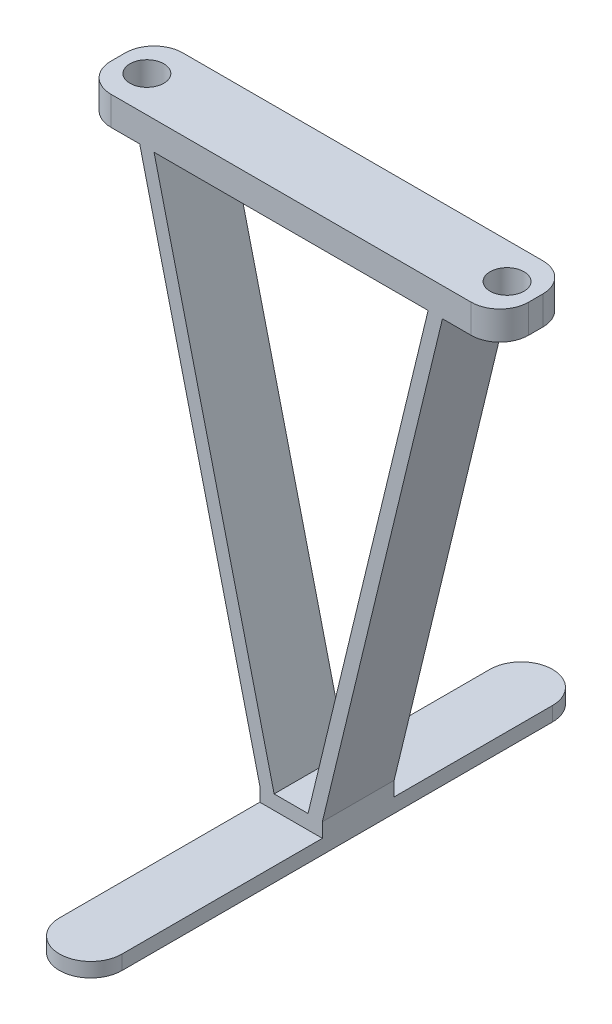
ISO-10303-21;
HEADER;
FILE_DESCRIPTION(('STEP AP214'),'2;1');
FILE_NAME('part.step','',(''),(''),'','','');
FILE_SCHEMA(('AUTOMOTIVE_DESIGN { 1 0 10303 214 1 1 1 1 }'));
ENDSEC;
DATA;
#1=APPLICATION_CONTEXT('core data for automotive mechanical design processes');
#2=APPLICATION_PROTOCOL_DEFINITION('international standard','automotive_design',2000,#1);
#3=PRODUCT_CONTEXT('',#1,'mechanical');
#4=PRODUCT('Part','Part','',(#3));
#5=PRODUCT_RELATED_PRODUCT_CATEGORY('part','',(#4));
#6=PRODUCT_DEFINITION_FORMATION('','',#4);
#7=PRODUCT_DEFINITION_CONTEXT('part definition',#1,'design');
#8=PRODUCT_DEFINITION('design','',#6,#7);
#9=PRODUCT_DEFINITION_SHAPE('','',#8);
#10=(LENGTH_UNIT() NAMED_UNIT(*) SI_UNIT(.MILLI.,.METRE.));
#11=(NAMED_UNIT(*) PLANE_ANGLE_UNIT() SI_UNIT($,.RADIAN.));
#12=(NAMED_UNIT(*) SI_UNIT($,.STERADIAN.) SOLID_ANGLE_UNIT());
#13=UNCERTAINTY_MEASURE_WITH_UNIT(LENGTH_MEASURE(1.E-05),#10,'distance_accuracy_value','');
#14=(GEOMETRIC_REPRESENTATION_CONTEXT(3) GLOBAL_UNCERTAINTY_ASSIGNED_CONTEXT((#13)) GLOBAL_UNIT_ASSIGNED_CONTEXT((#10,
#11,#12)) REPRESENTATION_CONTEXT('',''));
#15=CARTESIAN_POINT('',(0.,0.,0.));
#16=DIRECTION('',(0.,0.,1.));
#17=DIRECTION('',(1.,0.,0.));
#18=AXIS2_PLACEMENT_3D('',#15,#16,#17);
#19=CARTESIAN_POINT('',(33.3542059614696,0.,-1.27));
#20=DIRECTION('',(0.,-1.,0.));
#21=DIRECTION('',(0.,0.,-1.));
#22=AXIS2_PLACEMENT_3D('',#19,#20,#21);
#23=PLANE('',#22);
#24=DIRECTION('',(0.,0.,1.));
#25=VECTOR('',#24,1.);
#26=CARTESIAN_POINT('',(-22.7797940385304,0.,-6.35));
#27=LINE('',#26,#25);
#28=CARTESIAN_POINT('',(-22.7797940385304,0.,-6.35));
#29=VERTEX_POINT('',#28);
#30=CARTESIAN_POINT('',(-22.7797940385304,0.,6.34999999999999));
#31=VERTEX_POINT('',#30);
#32=EDGE_CURVE('E298',#29,#31,#27,.T.);
#33=ORIENTED_EDGE('',*,*,#32,.F.);
#34=DIRECTION('',(-1.,0.,0.));
#35=VECTOR('',#34,1.);
#36=CARTESIAN_POINT('',(27.702035124836,0.,-6.35));
#37=LINE('',#36,#35);
#38=CARTESIAN_POINT('',(25.7342059614696,0.,-6.35));
#39=VERTEX_POINT('',#38);
#40=EDGE_CURVE('E395',#39,#29,#37,.T.);
#41=ORIENTED_EDGE('',*,*,#40,.F.);
#42=DIRECTION('',(0.,0.,1.));
#43=VECTOR('',#42,1.);
#44=CARTESIAN_POINT('',(25.7342059614696,0.,-6.35));
#45=LINE('',#44,#43);
#46=CARTESIAN_POINT('',(25.7342059614696,0.,6.34999999999999));
#47=VERTEX_POINT('',#46);
#48=EDGE_CURVE('E308',#39,#47,#45,.T.);
#49=ORIENTED_EDGE('',*,*,#48,.T.);
#50=DIRECTION('',(1.,0.,0.));
#51=VECTOR('',#50,1.);
#52=CARTESIAN_POINT('',(27.702035124836,0.,6.35));
#53=LINE('',#52,#51);
#54=EDGE_CURVE('E382',#31,#47,#53,.T.);
#55=ORIENTED_EDGE('',*,*,#54,.F.);
#56=EDGE_LOOP('',(#33,#41,#49,#55));
#57=FACE_BOUND('',#56,.T.);
#58=ADVANCED_FACE('F49',(#57),#23,.T.);
#59=DIRECTION('',(0.,0.,1.));
#60=VECTOR('',#59,1.);
#61=CARTESIAN_POINT('',(28.2742059614696,0.,-6.35));
#62=LINE('',#61,#60);
#63=CARTESIAN_POINT('',(28.2742059614696,0.,-6.35));
#64=VERTEX_POINT('',#63);
#65=CARTESIAN_POINT('',(28.2742059614696,0.,6.34999999999999));
#66=VERTEX_POINT('',#65);
#67=EDGE_CURVE('E312',#64,#66,#62,.T.);
#68=ORIENTED_EDGE('',*,*,#67,.F.);
#69=CARTESIAN_POINT('',(33.3542059614696,0.,-6.35));
#70=VERTEX_POINT('',#69);
#71=EDGE_CURVE('E344',#70,#64,#37,.T.);
#72=ORIENTED_EDGE('',*,*,#71,.F.);
#73=CARTESIAN_POINT('',(33.3542059614696,0.,-1.27));
#74=DIRECTION('',(0.,1.,0.));
#75=DIRECTION('',(0.,0.,-1.));
#76=AXIS2_PLACEMENT_3D('',#73,#74,#75);
#77=CIRCLE('',#76,5.08);
#78=CARTESIAN_POINT('',(38.4342059614696,0.,-1.26999999999996));
#79=VERTEX_POINT('',#78);
#80=EDGE_CURVE('E388',#79,#70,#77,.T.);
#81=ORIENTED_EDGE('',*,*,#80,.F.);
#82=DIRECTION('',(0.,0.,-1.));
#83=VECTOR('',#82,1.);
#84=CARTESIAN_POINT('',(38.4342059614696,0.,-1.26999999999996));
#85=LINE('',#84,#83);
#86=CARTESIAN_POINT('',(38.4342059614696,0.,1.26999999999996));
#87=VERTEX_POINT('',#86);
#88=EDGE_CURVE('E385',#87,#79,#85,.T.);
#89=ORIENTED_EDGE('',*,*,#88,.F.);
#90=CARTESIAN_POINT('',(33.3542059614696,0.,1.27));
#91=DIRECTION('',(0.,1.,0.));
#92=DIRECTION('',(0.,0.,-1.));
#93=AXIS2_PLACEMENT_3D('',#90,#91,#92);
#94=CIRCLE('',#93,5.08);
#95=CARTESIAN_POINT('',(33.3542059614696,0.,6.35));
#96=VERTEX_POINT('',#95);
#97=EDGE_CURVE('E381',#96,#87,#94,.T.);
#98=ORIENTED_EDGE('',*,*,#97,.F.);
#99=EDGE_CURVE('E376',#66,#96,#53,.T.);
#100=ORIENTED_EDGE('',*,*,#99,.F.);
#101=EDGE_LOOP('',(#68,#72,#81,#89,#98,#100));
#102=FACE_BOUND('',#101,.T.);
#103=CARTESIAN_POINT('',(33.3542059614696,0.,0.));
#104=DIRECTION('',(0.,1.,0.));
#105=DIRECTION('',(0.,0.,1.));
#106=AXIS2_PLACEMENT_3D('',#103,#104,#105);
#107=CIRCLE('',#106,3.);
#108=CARTESIAN_POINT('',(33.3542059614696,0.,3.));
#109=VERTEX_POINT('',#108);
#110=EDGE_CURVE('E301',#109,#109,#107,.T.);
#111=ORIENTED_EDGE('',*,*,#110,.T.);
#112=EDGE_LOOP('',(#111));
#113=FACE_BOUND('',#112,.T.);
#114=ADVANCED_FACE('F480',(#102,#113),#23,.T.);
#115=CARTESIAN_POINT('',(33.3542059614696,5.08,-1.27));
#116=DIRECTION('',(0.,-1.,0.));
#117=DIRECTION('',(0.,0.,-1.));
#118=AXIS2_PLACEMENT_3D('',#115,#116,#117);
#119=PLANE('',#118);
#120=DIRECTION('',(-1.,0.,0.));
#121=VECTOR('',#120,1.);
#122=CARTESIAN_POINT('',(-24.7476232018967,5.08,-6.35));
#123=LINE('',#122,#121);
#124=CARTESIAN_POINT('',(33.3542059614696,5.08,-6.35));
#125=VERTEX_POINT('',#124);
#126=CARTESIAN_POINT('',(-30.3997940385303,5.08,-6.35));
#127=VERTEX_POINT('',#126);
#128=EDGE_CURVE('E340',#125,#127,#123,.T.);
#129=ORIENTED_EDGE('',*,*,#128,.T.);
#130=CARTESIAN_POINT('',(-30.3997940385304,5.08,-1.27));
#131=DIRECTION('',(0.,1.,0.));
#132=DIRECTION('',(0.,0.,-1.));
#133=AXIS2_PLACEMENT_3D('',#130,#131,#132);
#134=CIRCLE('',#133,5.08);
#135=CARTESIAN_POINT('',(-35.4797940385304,5.08,-1.26999999999996));
#136=VERTEX_POINT('',#135);
#137=EDGE_CURVE('E343',#127,#136,#134,.T.);
#138=ORIENTED_EDGE('',*,*,#137,.T.);
#139=DIRECTION('',(0.,0.,1.));
#140=VECTOR('',#139,1.);
#141=CARTESIAN_POINT('',(-35.4797940385304,5.08,-1.26999999999996));
#142=LINE('',#141,#140);
#143=CARTESIAN_POINT('',(-35.4797940385304,5.08,1.26999999999996));
#144=VERTEX_POINT('',#143);
#145=EDGE_CURVE('E347',#136,#144,#142,.T.);
#146=ORIENTED_EDGE('',*,*,#145,.T.);
#147=CARTESIAN_POINT('',(-30.3997940385304,5.08,1.27));
#148=DIRECTION('',(0.,1.,0.));
#149=DIRECTION('',(0.,0.,1.));
#150=AXIS2_PLACEMENT_3D('',#147,#148,#149);
#151=CIRCLE('',#150,5.08);
#152=CARTESIAN_POINT('',(-30.3997940385304,5.08,6.35));
#153=VERTEX_POINT('',#152);
#154=EDGE_CURVE('E350',#144,#153,#151,.T.);
#155=ORIENTED_EDGE('',*,*,#154,.T.);
#156=DIRECTION('',(1.,0.,0.));
#157=VECTOR('',#156,1.);
#158=CARTESIAN_POINT('',(-24.7476232018967,5.08,6.35));
#159=LINE('',#158,#157);
#160=CARTESIAN_POINT('',(33.3542059614696,5.08,6.35));
#161=VERTEX_POINT('',#160);
#162=EDGE_CURVE('E353',#153,#161,#159,.T.);
#163=ORIENTED_EDGE('',*,*,#162,.T.);
#164=CARTESIAN_POINT('',(33.3542059614696,5.08,1.27));
#165=DIRECTION('',(0.,1.,0.));
#166=DIRECTION('',(0.,0.,-1.));
#167=AXIS2_PLACEMENT_3D('',#164,#165,#166);
#168=CIRCLE('',#167,5.08);
#169=CARTESIAN_POINT('',(38.4342059614696,5.08,1.26999999999996));
#170=VERTEX_POINT('',#169);
#171=EDGE_CURVE('E356',#161,#170,#168,.T.);
#172=ORIENTED_EDGE('',*,*,#171,.T.);
#173=DIRECTION('',(0.,0.,-1.));
#174=VECTOR('',#173,1.);
#175=CARTESIAN_POINT('',(38.4342059614696,5.08,-1.26999999999996));
#176=LINE('',#175,#174);
#177=CARTESIAN_POINT('',(38.4342059614696,5.08,-1.26999999999996));
#178=VERTEX_POINT('',#177);
#179=EDGE_CURVE('E359',#170,#178,#176,.T.);
#180=ORIENTED_EDGE('',*,*,#179,.T.);
#181=CARTESIAN_POINT('',(33.3542059614696,5.08,-1.27));
#182=DIRECTION('',(0.,1.,0.));
#183=DIRECTION('',(0.,0.,-1.));
#184=AXIS2_PLACEMENT_3D('',#181,#182,#183);
#185=CIRCLE('',#184,5.08);
#186=EDGE_CURVE('E362',#178,#125,#185,.T.);
#187=ORIENTED_EDGE('',*,*,#186,.T.);
#188=EDGE_LOOP('',(#129,#138,#146,#155,#163,#172,#180,#187));
#189=FACE_BOUND('',#188,.T.);
#190=CARTESIAN_POINT('',(-30.3997940385304,5.08,0.));
#191=DIRECTION('',(0.,1.,0.));
#192=DIRECTION('',(0.,0.,1.));
#193=AXIS2_PLACEMENT_3D('',#190,#191,#192);
#194=CIRCLE('',#193,3.);
#195=CARTESIAN_POINT('',(-30.3997940385304,5.08,3.));
#196=VERTEX_POINT('',#195);
#197=EDGE_CURVE('E332',#196,#196,#194,.T.);
#198=ORIENTED_EDGE('',*,*,#197,.F.);
#199=EDGE_LOOP('',(#198));
#200=FACE_BOUND('',#199,.T.);
#201=CARTESIAN_POINT('',(33.3542059614696,5.08,0.));
#202=DIRECTION('',(0.,1.,0.));
#203=DIRECTION('',(0.,0.,1.));
#204=AXIS2_PLACEMENT_3D('',#201,#202,#203);
#205=CIRCLE('',#204,3.);
#206=CARTESIAN_POINT('',(33.3542059614696,5.08,3.));
#207=VERTEX_POINT('',#206);
#208=EDGE_CURVE('E324',#207,#207,#205,.T.);
#209=ORIENTED_EDGE('',*,*,#208,.F.);
#210=EDGE_LOOP('',(#209));
#211=FACE_BOUND('',#210,.T.);
#212=ADVANCED_FACE('F445',(#189,#200,#211),#119,.F.);
#213=DIRECTION('',(0.,0.,1.));
#214=VECTOR('',#213,1.);
#215=CARTESIAN_POINT('',(-25.3197940385304,0.,-6.35));
#216=LINE('',#215,#214);
#217=CARTESIAN_POINT('',(-25.3197940385304,0.,-6.35000000000001));
#218=VERTEX_POINT('',#217);
#219=CARTESIAN_POINT('',(-25.3197940385304,0.,6.34999999999999));
#220=VERTEX_POINT('',#219);
#221=EDGE_CURVE('E271',#218,#220,#216,.T.);
#222=ORIENTED_EDGE('',*,*,#221,.T.);
#223=CARTESIAN_POINT('',(-30.3997940385304,0.,6.35));
#224=VERTEX_POINT('',#223);
#225=EDGE_CURVE('E377',#224,#220,#53,.T.);
#226=ORIENTED_EDGE('',*,*,#225,.F.);
#227=CARTESIAN_POINT('',(-30.3997940385304,0.,1.27));
#228=DIRECTION('',(0.,1.,0.));
#229=DIRECTION('',(0.,0.,1.));
#230=AXIS2_PLACEMENT_3D('',#227,#228,#229);
#231=CIRCLE('',#230,5.08);
#232=CARTESIAN_POINT('',(-35.4797940385304,0.,1.26999999999996));
#233=VERTEX_POINT('',#232);
#234=EDGE_CURVE('E372',#233,#224,#231,.T.);
#235=ORIENTED_EDGE('',*,*,#234,.F.);
#236=DIRECTION('',(0.,0.,1.));
#237=VECTOR('',#236,1.);
#238=CARTESIAN_POINT('',(-35.4797940385304,0.,-1.26999999999996));
#239=LINE('',#238,#237);
#240=CARTESIAN_POINT('',(-35.4797940385304,0.,-1.26999999999996));
#241=VERTEX_POINT('',#240);
#242=EDGE_CURVE('E369',#241,#233,#239,.T.);
#243=ORIENTED_EDGE('',*,*,#242,.F.);
#244=CARTESIAN_POINT('',(-30.3997940385304,0.,-1.27));
#245=DIRECTION('',(0.,1.,0.));
#246=DIRECTION('',(0.,0.,-1.));
#247=AXIS2_PLACEMENT_3D('',#244,#245,#246);
#248=CIRCLE('',#247,5.08);
#249=CARTESIAN_POINT('',(-30.3997940385303,0.,-6.35));
#250=VERTEX_POINT('',#249);
#251=EDGE_CURVE('E336',#250,#241,#248,.T.);
#252=ORIENTED_EDGE('',*,*,#251,.F.);
#253=EDGE_CURVE('E391',#218,#250,#37,.T.);
#254=ORIENTED_EDGE('',*,*,#253,.F.);
#255=EDGE_LOOP('',(#222,#226,#235,#243,#252,#254));
#256=FACE_BOUND('',#255,.T.);
#257=CARTESIAN_POINT('',(-30.3997940385304,0.,0.));
#258=DIRECTION('',(0.,1.,0.));
#259=DIRECTION('',(0.,0.,1.));
#260=AXIS2_PLACEMENT_3D('',#257,#258,#259);
#261=CIRCLE('',#260,3.);
#262=CARTESIAN_POINT('',(-30.3997940385304,0.,3.));
#263=VERTEX_POINT('',#262);
#264=EDGE_CURVE('E328',#263,#263,#261,.T.);
#265=ORIENTED_EDGE('',*,*,#264,.T.);
#266=EDGE_LOOP('',(#265));
#267=FACE_BOUND('',#266,.T.);
#268=ADVANCED_FACE('F431',(#256,#267),#23,.T.);
#269=CARTESIAN_POINT('',(-30.3997940385304,5.08,-1.27));
#270=DIRECTION('',(0.,-1.,0.));
#271=DIRECTION('',(0.,0.,-1.));
#272=AXIS2_PLACEMENT_3D('',#269,#270,#271);
#273=CYLINDRICAL_SURFACE('',#272,5.08);
#274=ORIENTED_EDGE('',*,*,#251,.T.);
#275=DIRECTION('',(0.,-1.,0.));
#276=VECTOR('',#275,1.);
#277=CARTESIAN_POINT('',(-35.4797940385304,5.08,-1.26999999999996));
#278=LINE('',#277,#276);
#279=EDGE_CURVE('E58',#136,#241,#278,.T.);
#280=ORIENTED_EDGE('',*,*,#279,.F.);
#281=ORIENTED_EDGE('',*,*,#137,.F.);
#282=DIRECTION('',(0.,-1.,0.));
#283=VECTOR('',#282,1.);
#284=CARTESIAN_POINT('',(-30.3997940385303,5.08,-6.35));
#285=LINE('',#284,#283);
#286=EDGE_CURVE('E11',#127,#250,#285,.T.);
#287=ORIENTED_EDGE('',*,*,#286,.T.);
#288=EDGE_LOOP('',(#274,#280,#281,#287));
#289=FACE_BOUND('',#288,.T.);
#290=ADVANCED_FACE('F51',(#289),#273,.T.);
#291=CARTESIAN_POINT('',(-35.4797940385304,5.08,-1.26999999999996));
#292=DIRECTION('',(1.,0.,0.));
#293=DIRECTION('',(0.,0.,-1.));
#294=AXIS2_PLACEMENT_3D('',#291,#292,#293);
#295=PLANE('',#294);
#296=ORIENTED_EDGE('',*,*,#242,.T.);
#297=DIRECTION('',(0.,-1.,0.));
#298=VECTOR('',#297,1.);
#299=CARTESIAN_POINT('',(-35.4797940385304,5.08,1.26999999999996));
#300=LINE('',#299,#298);
#301=EDGE_CURVE('E414',#144,#233,#300,.T.);
#302=ORIENTED_EDGE('',*,*,#301,.F.);
#303=ORIENTED_EDGE('',*,*,#145,.F.);
#304=ORIENTED_EDGE('',*,*,#279,.T.);
#305=EDGE_LOOP('',(#296,#302,#303,#304));
#306=FACE_BOUND('',#305,.T.);
#307=ADVANCED_FACE('F424',(#306),#295,.F.);
#308=CARTESIAN_POINT('',(-30.3997940385304,5.08,1.27));
#309=DIRECTION('',(0.,-1.,0.));
#310=DIRECTION('',(0.,0.,-1.));
#311=AXIS2_PLACEMENT_3D('',#308,#309,#310);
#312=CYLINDRICAL_SURFACE('',#311,5.08);
#313=ORIENTED_EDGE('',*,*,#234,.T.);
#314=DIRECTION('',(0.,-1.,0.));
#315=VECTOR('',#314,1.);
#316=CARTESIAN_POINT('',(-30.3997940385304,5.08,6.35));
#317=LINE('',#316,#315);
#318=EDGE_CURVE('E410',#153,#224,#317,.T.);
#319=ORIENTED_EDGE('',*,*,#318,.F.);
#320=ORIENTED_EDGE('',*,*,#154,.F.);
#321=ORIENTED_EDGE('',*,*,#301,.T.);
#322=EDGE_LOOP('',(#313,#319,#320,#321));
#323=FACE_BOUND('',#322,.T.);
#324=ADVANCED_FACE('F436',(#323),#312,.T.);
#325=CARTESIAN_POINT('',(27.702035124836,5.08,6.35));
#326=DIRECTION('',(0.,0.,-1.));
#327=DIRECTION('',(-1.,0.,0.));
#328=AXIS2_PLACEMENT_3D('',#325,#326,#327);
#329=PLANE('',#328);
#330=ORIENTED_EDGE('',*,*,#225,.T.);
#331=DIRECTION('',(0.23545280333934,-0.971885784132912,0.));
#332=VECTOR('',#331,1.);
#333=CARTESIAN_POINT('',(-25.3197940385304,0.,6.34999999999999));
#334=LINE('',#333,#332);
#335=CARTESIAN_POINT('',(-4.06279403853036,-87.7431732402802,6.34999999999999));
#336=VERTEX_POINT('',#335);
#337=EDGE_CURVE('E232',#220,#336,#334,.T.);
#338=ORIENTED_EDGE('',*,*,#337,.T.);
#339=DIRECTION('',(0.,-1.,0.));
#340=VECTOR('',#339,1.);
#341=CARTESIAN_POINT('',(-4.06279403853036,-87.7431732402802,6.34999999999999));
#342=LINE('',#341,#340);
#343=CARTESIAN_POINT('',(-4.06279403853036,-90.2831732402802,6.34999999999999));
#344=VERTEX_POINT('',#343);
#345=EDGE_CURVE('E238',#336,#344,#342,.T.);
#346=ORIENTED_EDGE('',*,*,#345,.T.);
#347=DIRECTION('',(1.,0.,0.));
#348=VECTOR('',#347,1.);
#349=CARTESIAN_POINT('',(7.01720596146964,-90.2831732402802,6.34999999999999));
#350=LINE('',#349,#348);
#351=CARTESIAN_POINT('',(7.01720596146964,-90.2831732402802,6.34999999999999));
#352=VERTEX_POINT('',#351);
#353=EDGE_CURVE('E275',#344,#352,#350,.T.);
#354=ORIENTED_EDGE('',*,*,#353,.T.);
#355=DIRECTION('',(0.,1.,0.));
#356=VECTOR('',#355,1.);
#357=CARTESIAN_POINT('',(7.01720596146964,-87.7431732402802,6.34999999999999));
#358=LINE('',#357,#356);
#359=CARTESIAN_POINT('',(7.01720596146964,-87.7431732402802,6.34999999999999));
#360=VERTEX_POINT('',#359);
#361=EDGE_CURVE('E279',#352,#360,#358,.T.);
#362=ORIENTED_EDGE('',*,*,#361,.T.);
#363=DIRECTION('',(0.235452803339339,0.971885784132912,0.));
#364=VECTOR('',#363,1.);
#365=CARTESIAN_POINT('',(28.2742059614696,0.,6.34999999999999));
#366=LINE('',#365,#364);
#367=EDGE_CURVE('E283',#360,#66,#366,.T.);
#368=ORIENTED_EDGE('',*,*,#367,.T.);
#369=ORIENTED_EDGE('',*,*,#99,.T.);
#370=DIRECTION('',(0.,-1.,0.));
#371=VECTOR('',#370,1.);
#372=CARTESIAN_POINT('',(33.3542059614696,5.08,6.35));
#373=LINE('',#372,#371);
#374=EDGE_CURVE('E406',#161,#96,#373,.T.);
#375=ORIENTED_EDGE('',*,*,#374,.F.);
#376=ORIENTED_EDGE('',*,*,#162,.F.);
#377=ORIENTED_EDGE('',*,*,#318,.T.);
#378=EDGE_LOOP('',(#330,#338,#346,#354,#362,#368,#369,#375,#376,#377));
#379=FACE_BOUND('',#378,.T.);
#380=DIRECTION('',(-0.23545280333934,0.971885784132912,0.));
#381=VECTOR('',#380,1.);
#382=CARTESIAN_POINT('',(-22.7797940385304,0.,6.34999999999999));
#383=LINE('',#382,#381);
#384=CARTESIAN_POINT('',(-1.52279403853036,-87.7431732402802,6.34999999999999));
#385=VERTEX_POINT('',#384);
#386=EDGE_CURVE('E248',#385,#31,#383,.T.);
#387=ORIENTED_EDGE('',*,*,#386,.T.);
#388=ORIENTED_EDGE('',*,*,#54,.T.);
#389=DIRECTION('',(-0.23545280333934,-0.971885784132912,0.));
#390=VECTOR('',#389,1.);
#391=CARTESIAN_POINT('',(25.7342059614696,0.,6.34999999999999));
#392=LINE('',#391,#390);
#393=CARTESIAN_POINT('',(4.4772059614696,-87.7431732402802,6.34999999999999));
#394=VERTEX_POINT('',#393);
#395=EDGE_CURVE('E287',#47,#394,#392,.T.);
#396=ORIENTED_EDGE('',*,*,#395,.T.);
#397=DIRECTION('',(-1.,0.,0.));
#398=VECTOR('',#397,1.);
#399=CARTESIAN_POINT('',(4.4772059614696,-87.7431732402802,6.34999999999999));
#400=LINE('',#399,#398);
#401=EDGE_CURVE('E291',#394,#385,#400,.T.);
#402=ORIENTED_EDGE('',*,*,#401,.T.);
#403=EDGE_LOOP('',(#387,#388,#396,#402));
#404=FACE_BOUND('',#403,.T.);
#405=ADVANCED_FACE('F440',(#379,#404),#329,.F.);
#406=CARTESIAN_POINT('',(33.3542059614696,5.08,1.27));
#407=DIRECTION('',(0.,-1.,0.));
#408=DIRECTION('',(0.,0.,-1.));
#409=AXIS2_PLACEMENT_3D('',#406,#407,#408);
#410=CYLINDRICAL_SURFACE('',#409,5.08);
#411=ORIENTED_EDGE('',*,*,#97,.T.);
#412=DIRECTION('',(0.,-1.,0.));
#413=VECTOR('',#412,1.);
#414=CARTESIAN_POINT('',(38.4342059614696,5.08,1.26999999999996));
#415=LINE('',#414,#413);
#416=EDGE_CURVE('E402',#170,#87,#415,.T.);
#417=ORIENTED_EDGE('',*,*,#416,.F.);
#418=ORIENTED_EDGE('',*,*,#171,.F.);
#419=ORIENTED_EDGE('',*,*,#374,.T.);
#420=EDGE_LOOP('',(#411,#417,#418,#419));
#421=FACE_BOUND('',#420,.T.);
#422=ADVANCED_FACE('F598',(#421),#410,.T.);
#423=CARTESIAN_POINT('',(38.4342059614696,5.08,-1.26999999999996));
#424=DIRECTION('',(-1.,0.,0.));
#425=DIRECTION('',(0.,0.,1.));
#426=AXIS2_PLACEMENT_3D('',#423,#424,#425);
#427=PLANE('',#426);
#428=ORIENTED_EDGE('',*,*,#88,.T.);
#429=DIRECTION('',(0.,-1.,0.));
#430=VECTOR('',#429,1.);
#431=CARTESIAN_POINT('',(38.4342059614696,5.08,-1.26999999999996));
#432=LINE('',#431,#430);
#433=EDGE_CURVE('E399',#178,#79,#432,.T.);
#434=ORIENTED_EDGE('',*,*,#433,.F.);
#435=ORIENTED_EDGE('',*,*,#179,.F.);
#436=ORIENTED_EDGE('',*,*,#416,.T.);
#437=EDGE_LOOP('',(#428,#434,#435,#436));
#438=FACE_BOUND('',#437,.T.);
#439=ADVANCED_FACE('F705',(#438),#427,.F.);
#440=CARTESIAN_POINT('',(33.3542059614696,5.08,-1.27));
#441=DIRECTION('',(0.,-1.,0.));
#442=DIRECTION('',(0.,0.,-1.));
#443=AXIS2_PLACEMENT_3D('',#440,#441,#442);
#444=CYLINDRICAL_SURFACE('',#443,5.08);
#445=ORIENTED_EDGE('',*,*,#80,.T.);
#446=DIRECTION('',(0.,-1.,0.));
#447=VECTOR('',#446,1.);
#448=CARTESIAN_POINT('',(33.3542059614696,5.08,-6.35));
#449=LINE('',#448,#447);
#450=EDGE_CURVE('E366',#125,#70,#449,.T.);
#451=ORIENTED_EDGE('',*,*,#450,.F.);
#452=ORIENTED_EDGE('',*,*,#186,.F.);
#453=ORIENTED_EDGE('',*,*,#433,.T.);
#454=EDGE_LOOP('',(#445,#451,#452,#453));
#455=FACE_BOUND('',#454,.T.);
#456=ADVANCED_FACE('F609',(#455),#444,.T.);
#457=CARTESIAN_POINT('',(27.702035124836,5.08,-6.35));
#458=DIRECTION('',(0.,0.,1.));
#459=DIRECTION('',(1.,0.,0.));
#460=AXIS2_PLACEMENT_3D('',#457,#458,#459);
#461=PLANE('',#460);
#462=DIRECTION('',(0.23545280333934,-0.971885784132912,0.));
#463=VECTOR('',#462,1.);
#464=CARTESIAN_POINT('',(-25.3197940385304,0.,-6.35));
#465=LINE('',#464,#463);
#466=CARTESIAN_POINT('',(-4.06279403853036,-87.7431732402802,-6.35));
#467=VERTEX_POINT('',#466);
#468=EDGE_CURVE('E65',#218,#467,#465,.T.);
#469=ORIENTED_EDGE('',*,*,#468,.F.);
#470=ORIENTED_EDGE('',*,*,#253,.T.);
#471=ORIENTED_EDGE('',*,*,#286,.F.);
#472=ORIENTED_EDGE('',*,*,#128,.F.);
#473=ORIENTED_EDGE('',*,*,#450,.T.);
#474=ORIENTED_EDGE('',*,*,#71,.T.);
#475=DIRECTION('',(0.235452803339339,0.971885784132912,0.));
#476=VECTOR('',#475,1.);
#477=CARTESIAN_POINT('',(28.2742059614696,0.,-6.35));
#478=LINE('',#477,#476);
#479=CARTESIAN_POINT('',(7.01720596146964,-87.7431732402802,-6.35));
#480=VERTEX_POINT('',#479);
#481=EDGE_CURVE('E260',#480,#64,#478,.T.);
#482=ORIENTED_EDGE('',*,*,#481,.F.);
#483=DIRECTION('',(0.,1.,0.));
#484=VECTOR('',#483,1.);
#485=CARTESIAN_POINT('',(7.01720596146964,-87.7431732402802,-6.35));
#486=LINE('',#485,#484);
#487=CARTESIAN_POINT('',(7.01720596146965,-90.2831732402802,-6.34999999999999));
#488=VERTEX_POINT('',#487);
#489=EDGE_CURVE('E256',#488,#480,#486,.T.);
#490=ORIENTED_EDGE('',*,*,#489,.F.);
#491=DIRECTION('',(1.,0.,0.));
#492=VECTOR('',#491,1.);
#493=CARTESIAN_POINT('',(7.01720596146964,-90.2831732402802,-6.35));
#494=LINE('',#493,#492);
#495=CARTESIAN_POINT('',(-4.06279403853036,-90.2831732402802,-6.35));
#496=VERTEX_POINT('',#495);
#497=EDGE_CURVE('E252',#496,#488,#494,.T.);
#498=ORIENTED_EDGE('',*,*,#497,.F.);
#499=DIRECTION('',(0.,-1.,0.));
#500=VECTOR('',#499,1.);
#501=CARTESIAN_POINT('',(-4.06279403853036,-87.7431732402802,-6.35));
#502=LINE('',#501,#500);
#503=EDGE_CURVE('E247',#467,#496,#502,.T.);
#504=ORIENTED_EDGE('',*,*,#503,.F.);
#505=EDGE_LOOP('',(#469,#470,#471,#472,#473,#474,#482,#490,#498,#504));
#506=FACE_BOUND('',#505,.T.);
#507=ORIENTED_EDGE('',*,*,#40,.T.);
#508=DIRECTION('',(-0.23545280333934,0.971885784132912,0.));
#509=VECTOR('',#508,1.);
#510=CARTESIAN_POINT('',(-22.7797940385304,0.,-6.35));
#511=LINE('',#510,#509);
#512=CARTESIAN_POINT('',(-1.52279403853036,-87.7431732402802,-6.35));
#513=VERTEX_POINT('',#512);
#514=EDGE_CURVE('E269',#513,#29,#511,.T.);
#515=ORIENTED_EDGE('',*,*,#514,.F.);
#516=DIRECTION('',(-1.,0.,0.));
#517=VECTOR('',#516,1.);
#518=CARTESIAN_POINT('',(4.4772059614696,-87.7431732402802,-6.35));
#519=LINE('',#518,#517);
#520=CARTESIAN_POINT('',(4.4772059614696,-87.7431732402802,-6.35));
#521=VERTEX_POINT('',#520);
#522=EDGE_CURVE('E265',#521,#513,#519,.T.);
#523=ORIENTED_EDGE('',*,*,#522,.F.);
#524=DIRECTION('',(-0.23545280333934,-0.971885784132912,0.));
#525=VECTOR('',#524,1.);
#526=CARTESIAN_POINT('',(25.7342059614696,0.,-6.35));
#527=LINE('',#526,#525);
#528=EDGE_CURVE('E73',#39,#521,#527,.T.);
#529=ORIENTED_EDGE('',*,*,#528,.F.);
#530=EDGE_LOOP('',(#507,#515,#523,#529));
#531=FACE_BOUND('',#530,.T.);
#532=ADVANCED_FACE('F449',(#506,#531),#461,.F.);
#533=CARTESIAN_POINT('',(-30.3997940385304,5.08,0.));
#534=DIRECTION('',(0.,-1.,0.));
#535=DIRECTION('',(0.,0.,-1.));
#536=AXIS2_PLACEMENT_3D('',#533,#534,#535);
#537=CYLINDRICAL_SURFACE('',#536,3.);
#538=ORIENTED_EDGE('',*,*,#197,.T.);
#539=EDGE_LOOP('',(#538));
#540=FACE_BOUND('',#539,.T.);
#541=ORIENTED_EDGE('',*,*,#264,.F.);
#542=EDGE_LOOP('',(#541));
#543=FACE_BOUND('',#542,.T.);
#544=ADVANCED_FACE('F493',(#540,#543),#537,.F.);
#545=CARTESIAN_POINT('',(33.3542059614696,5.08,0.));
#546=DIRECTION('',(0.,-1.,0.));
#547=DIRECTION('',(0.,0.,-1.));
#548=AXIS2_PLACEMENT_3D('',#545,#546,#547);
#549=CYLINDRICAL_SURFACE('',#548,3.);
#550=ORIENTED_EDGE('',*,*,#208,.T.);
#551=EDGE_LOOP('',(#550));
#552=FACE_BOUND('',#551,.T.);
#553=ORIENTED_EDGE('',*,*,#110,.F.);
#554=EDGE_LOOP('',(#553));
#555=FACE_BOUND('',#554,.T.);
#556=ADVANCED_FACE('F496',(#552,#555),#549,.F.);
#557=CARTESIAN_POINT('',(-22.7797940385304,0.,-6.35));
#558=DIRECTION('',(0.971885784132912,0.23545280333934,0.));
#559=DIRECTION('',(-0.23545280333934,0.971885784132912,0.));
#560=AXIS2_PLACEMENT_3D('',#557,#558,#559);
#561=PLANE('',#560);
#562=ORIENTED_EDGE('',*,*,#386,.F.);
#563=DIRECTION('',(0.,0.,1.));
#564=VECTOR('',#563,1.);
#565=CARTESIAN_POINT('',(-1.52279403853036,-87.7431732402802,-6.35));
#566=LINE('',#565,#564);
#567=EDGE_CURVE('E302',#513,#385,#566,.T.);
#568=ORIENTED_EDGE('',*,*,#567,.F.);
#569=ORIENTED_EDGE('',*,*,#514,.T.);
#570=ORIENTED_EDGE('',*,*,#32,.T.);
#571=EDGE_LOOP('',(#562,#568,#569,#570));
#572=FACE_BOUND('',#571,.T.);
#573=ADVANCED_FACE('F463',(#572),#561,.T.);
#574=CARTESIAN_POINT('',(4.4772059614696,-87.7431732402802,-6.35));
#575=DIRECTION('',(0.,1.,0.));
#576=DIRECTION('',(0.,0.,1.));
#577=AXIS2_PLACEMENT_3D('',#574,#575,#576);
#578=PLANE('',#577);
#579=ORIENTED_EDGE('',*,*,#401,.F.);
#580=DIRECTION('',(0.,0.,1.));
#581=VECTOR('',#580,1.);
#582=CARTESIAN_POINT('',(4.4772059614696,-87.7431732402802,-6.35));
#583=LINE('',#582,#581);
#584=EDGE_CURVE('E305',#521,#394,#583,.T.);
#585=ORIENTED_EDGE('',*,*,#584,.F.);
#586=ORIENTED_EDGE('',*,*,#522,.T.);
#587=ORIENTED_EDGE('',*,*,#567,.T.);
#588=EDGE_LOOP('',(#579,#585,#586,#587));
#589=FACE_BOUND('',#588,.T.);
#590=ADVANCED_FACE('F466',(#589),#578,.T.);
#591=CARTESIAN_POINT('',(25.7342059614696,0.,-6.35));
#592=DIRECTION('',(-0.971885784132912,0.23545280333934,0.));
#593=DIRECTION('',(-0.23545280333934,-0.971885784132912,0.));
#594=AXIS2_PLACEMENT_3D('',#591,#592,#593);
#595=PLANE('',#594);
#596=ORIENTED_EDGE('',*,*,#395,.F.);
#597=ORIENTED_EDGE('',*,*,#48,.F.);
#598=ORIENTED_EDGE('',*,*,#528,.T.);
#599=ORIENTED_EDGE('',*,*,#584,.T.);
#600=EDGE_LOOP('',(#596,#597,#598,#599));
#601=FACE_BOUND('',#600,.T.);
#602=ADVANCED_FACE('F468',(#601),#595,.T.);
#603=CARTESIAN_POINT('',(28.2742059614696,0.,-6.35));
#604=DIRECTION('',(0.971885784132912,-0.235452803339339,0.));
#605=DIRECTION('',(0.235452803339339,0.971885784132913,0.));
#606=AXIS2_PLACEMENT_3D('',#603,#604,#605);
#607=PLANE('',#606);
#608=ORIENTED_EDGE('',*,*,#367,.F.);
#609=DIRECTION('',(0.,0.,1.));
#610=VECTOR('',#609,1.);
#611=CARTESIAN_POINT('',(7.01720596146964,-87.7431732402802,-6.35));
#612=LINE('',#611,#610);
#613=EDGE_CURVE('E315',#480,#360,#612,.T.);
#614=ORIENTED_EDGE('',*,*,#613,.F.);
#615=ORIENTED_EDGE('',*,*,#481,.T.);
#616=ORIENTED_EDGE('',*,*,#67,.T.);
#617=EDGE_LOOP('',(#608,#614,#615,#616));
#618=FACE_BOUND('',#617,.T.);
#619=ADVANCED_FACE('F470',(#618),#607,.T.);
#620=CARTESIAN_POINT('',(7.01720596146964,-87.7431732402802,-6.35));
#621=DIRECTION('',(1.,0.,0.));
#622=DIRECTION('',(0.,1.,0.));
#623=AXIS2_PLACEMENT_3D('',#620,#621,#622);
#624=PLANE('',#623);
#625=ORIENTED_EDGE('',*,*,#361,.F.);
#626=DIRECTION('',(0.,0.,1.));
#627=VECTOR('',#626,1.);
#628=CARTESIAN_POINT('',(7.01720596146965,-90.2831732402802,41.8087252204998));
#629=LINE('',#628,#627);
#630=CARTESIAN_POINT('',(7.01720596146965,-90.2831732402802,41.8087252204998));
#631=VERTEX_POINT('',#630);
#632=EDGE_CURVE('E512',#352,#631,#629,.T.);
#633=ORIENTED_EDGE('',*,*,#632,.T.);
#634=DIRECTION('',(0.,1.,0.));
#635=VECTOR('',#634,1.);
#636=CARTESIAN_POINT('',(7.01720596146965,-92.8231732402802,41.8087252204998));
#637=LINE('',#636,#635);
#638=CARTESIAN_POINT('',(7.01720596146965,-92.8231732402802,41.8087252204998));
#639=VERTEX_POINT('',#638);
#640=EDGE_CURVE('E528',#639,#631,#637,.T.);
#641=ORIENTED_EDGE('',*,*,#640,.F.);
#642=DIRECTION('',(0.,0.,1.));
#643=VECTOR('',#642,1.);
#644=CARTESIAN_POINT('',(7.01720596146965,-92.8231732402802,41.8087252204998));
#645=LINE('',#644,#643);
#646=CARTESIAN_POINT('',(7.01720596146965,-92.8231732402802,-34.3912747795002));
#647=VERTEX_POINT('',#646);
#648=EDGE_CURVE('E221',#647,#639,#645,.T.);
#649=ORIENTED_EDGE('',*,*,#648,.F.);
#650=DIRECTION('',(0.,1.,0.));
#651=VECTOR('',#650,1.);
#652=CARTESIAN_POINT('',(7.01720596146965,-92.8231732402802,-34.3912747795002));
#653=LINE('',#652,#651);
#654=CARTESIAN_POINT('',(7.01720596146965,-90.2831732402802,-34.3912747795002));
#655=VERTEX_POINT('',#654);
#656=EDGE_CURVE('E241',#647,#655,#653,.T.);
#657=ORIENTED_EDGE('',*,*,#656,.T.);
#658=EDGE_CURVE('E226',#655,#488,#629,.T.);
#659=ORIENTED_EDGE('',*,*,#658,.T.);
#660=ORIENTED_EDGE('',*,*,#489,.T.);
#661=ORIENTED_EDGE('',*,*,#613,.T.);
#662=EDGE_LOOP('',(#625,#633,#641,#649,#657,#659,#660,#661));
#663=FACE_BOUND('',#662,.T.);
#664=ADVANCED_FACE('F475',(#663),#624,.T.);
#665=CARTESIAN_POINT('',(-4.06279403853036,-87.7431732402802,-6.35));
#666=DIRECTION('',(-1.,0.,0.));
#667=DIRECTION('',(0.,0.,1.));
#668=AXIS2_PLACEMENT_3D('',#665,#666,#667);
#669=PLANE('',#668);
#670=ORIENTED_EDGE('',*,*,#345,.F.);
#671=DIRECTION('',(0.,0.,1.));
#672=VECTOR('',#671,1.);
#673=CARTESIAN_POINT('',(-4.06279403853036,-87.7431732402802,-6.35));
#674=LINE('',#673,#672);
#675=EDGE_CURVE('E318',#467,#336,#674,.T.);
#676=ORIENTED_EDGE('',*,*,#675,.F.);
#677=ORIENTED_EDGE('',*,*,#503,.T.);
#678=DIRECTION('',(0.,0.,-1.));
#679=VECTOR('',#678,1.);
#680=CARTESIAN_POINT('',(-4.06279403853034,-90.2831732402802,41.8087252204998));
#681=LINE('',#680,#679);
#682=CARTESIAN_POINT('',(-4.06279403853035,-90.2831732402802,-34.3912747795002));
#683=VERTEX_POINT('',#682);
#684=EDGE_CURVE('E540',#496,#683,#681,.T.);
#685=ORIENTED_EDGE('',*,*,#684,.T.);
#686=DIRECTION('',(0.,1.,0.));
#687=VECTOR('',#686,1.);
#688=CARTESIAN_POINT('',(-4.06279403853035,-92.8231732402802,-34.3912747795002));
#689=LINE('',#688,#687);
#690=CARTESIAN_POINT('',(-4.06279403853035,-92.8231732402802,-34.3912747795002));
#691=VERTEX_POINT('',#690);
#692=EDGE_CURVE('E211',#691,#683,#689,.T.);
#693=ORIENTED_EDGE('',*,*,#692,.F.);
#694=DIRECTION('',(0.,0.,-1.));
#695=VECTOR('',#694,1.);
#696=CARTESIAN_POINT('',(-4.06279403853034,-92.8231732402802,41.8087252204998));
#697=LINE('',#696,#695);
#698=CARTESIAN_POINT('',(-4.06279403853034,-92.8231732402802,41.8087252204998));
#699=VERTEX_POINT('',#698);
#700=EDGE_CURVE('E202',#699,#691,#697,.T.);
#701=ORIENTED_EDGE('',*,*,#700,.F.);
#702=DIRECTION('',(0.,1.,0.));
#703=VECTOR('',#702,1.);
#704=CARTESIAN_POINT('',(-4.06279403853034,-92.8231732402802,41.8087252204998));
#705=LINE('',#704,#703);
#706=CARTESIAN_POINT('',(-4.06279403853034,-90.2831732402802,41.8087252204998));
#707=VERTEX_POINT('',#706);
#708=EDGE_CURVE('E208',#699,#707,#705,.T.);
#709=ORIENTED_EDGE('',*,*,#708,.T.);
#710=EDGE_CURVE('E524',#707,#344,#681,.T.);
#711=ORIENTED_EDGE('',*,*,#710,.T.);
#712=EDGE_LOOP('',(#670,#676,#677,#685,#693,#701,#709,#711));
#713=FACE_BOUND('',#712,.T.);
#714=ADVANCED_FACE('F205',(#713),#669,.T.);
#715=CARTESIAN_POINT('',(-25.3197940385304,0.,-6.35));
#716=DIRECTION('',(-0.971885784132912,-0.23545280333934,0.));
#717=DIRECTION('',(0.23545280333934,-0.971885784132912,0.));
#718=AXIS2_PLACEMENT_3D('',#715,#716,#717);
#719=PLANE('',#718);
#720=ORIENTED_EDGE('',*,*,#337,.F.);
#721=ORIENTED_EDGE('',*,*,#221,.F.);
#722=ORIENTED_EDGE('',*,*,#468,.T.);
#723=ORIENTED_EDGE('',*,*,#675,.T.);
#724=EDGE_LOOP('',(#720,#721,#722,#723));
#725=FACE_BOUND('',#724,.T.);
#726=ADVANCED_FACE('F501',(#725),#719,.T.);
#727=CARTESIAN_POINT('',(1.47720596146966,-90.2831732402802,41.8087252204998));
#728=DIRECTION('',(0.,1.,0.));
#729=DIRECTION('',(0.,0.,1.));
#730=AXIS2_PLACEMENT_3D('',#727,#728,#729);
#731=PLANE('',#730);
#732=ORIENTED_EDGE('',*,*,#353,.F.);
#733=ORIENTED_EDGE('',*,*,#710,.F.);
#734=CARTESIAN_POINT('',(1.47720596146966,-90.2831732402802,41.8087252204998));
#735=DIRECTION('',(0.,-1.,0.));
#736=DIRECTION('',(0.,0.,1.));
#737=AXIS2_PLACEMENT_3D('',#734,#735,#736);
#738=CIRCLE('',#737,5.53999999999999);
#739=EDGE_CURVE('E230',#631,#707,#738,.T.);
#740=ORIENTED_EDGE('',*,*,#739,.F.);
#741=ORIENTED_EDGE('',*,*,#632,.F.);
#742=EDGE_LOOP('',(#732,#733,#740,#741));
#743=FACE_BOUND('',#742,.T.);
#744=ADVANCED_FACE('F504',(#743),#731,.T.);
#745=CARTESIAN_POINT('',(1.47720596146966,-92.8231732402802,41.8087252204998));
#746=DIRECTION('',(0.,1.,0.));
#747=DIRECTION('',(0.,0.,1.));
#748=AXIS2_PLACEMENT_3D('',#745,#746,#747);
#749=CYLINDRICAL_SURFACE('',#748,5.53999999999999);
#750=ORIENTED_EDGE('',*,*,#739,.T.);
#751=ORIENTED_EDGE('',*,*,#708,.F.);
#752=CARTESIAN_POINT('',(1.47720596146966,-92.8231732402802,41.8087252204998));
#753=DIRECTION('',(0.,-1.,0.));
#754=DIRECTION('',(0.,0.,1.));
#755=AXIS2_PLACEMENT_3D('',#752,#753,#754);
#756=CIRCLE('',#755,5.53999999999999);
#757=EDGE_CURVE('E216',#639,#699,#756,.T.);
#758=ORIENTED_EDGE('',*,*,#757,.F.);
#759=ORIENTED_EDGE('',*,*,#640,.T.);
#760=EDGE_LOOP('',(#750,#751,#758,#759));
#761=FACE_BOUND('',#760,.T.);
#762=ADVANCED_FACE('F228',(#761),#749,.T.);
#763=CARTESIAN_POINT('',(1.47720596146965,-92.8231732402802,-34.3912747795002));
#764=DIRECTION('',(0.,1.,0.));
#765=DIRECTION('',(0.,0.,1.));
#766=AXIS2_PLACEMENT_3D('',#763,#764,#765);
#767=CYLINDRICAL_SURFACE('',#766,5.54);
#768=CARTESIAN_POINT('',(1.47720596146965,-90.2831732402802,-34.3912747795002));
#769=DIRECTION('',(0.,-1.,0.));
#770=DIRECTION('',(0.,0.,-1.));
#771=AXIS2_PLACEMENT_3D('',#768,#769,#770);
#772=CIRCLE('',#771,5.54);
#773=EDGE_CURVE('E517',#683,#655,#772,.T.);
#774=ORIENTED_EDGE('',*,*,#773,.T.);
#775=ORIENTED_EDGE('',*,*,#656,.F.);
#776=CARTESIAN_POINT('',(1.47720596146965,-92.8231732402802,-34.3912747795002));
#777=DIRECTION('',(0.,-1.,0.));
#778=DIRECTION('',(0.,0.,-1.));
#779=AXIS2_PLACEMENT_3D('',#776,#777,#778);
#780=CIRCLE('',#779,5.54);
#781=EDGE_CURVE('E215',#691,#647,#780,.T.);
#782=ORIENTED_EDGE('',*,*,#781,.F.);
#783=ORIENTED_EDGE('',*,*,#692,.T.);
#784=EDGE_LOOP('',(#774,#775,#782,#783));
#785=FACE_BOUND('',#784,.T.);
#786=ADVANCED_FACE('F551',(#785),#767,.T.);
#787=CARTESIAN_POINT('',(1.47720596146966,-92.8231732402802,41.8087252204998));
#788=DIRECTION('',(0.,1.,0.));
#789=DIRECTION('',(0.,0.,1.));
#790=AXIS2_PLACEMENT_3D('',#787,#788,#789);
#791=PLANE('',#790);
#792=ORIENTED_EDGE('',*,*,#757,.T.);
#793=ORIENTED_EDGE('',*,*,#700,.T.);
#794=ORIENTED_EDGE('',*,*,#781,.T.);
#795=ORIENTED_EDGE('',*,*,#648,.T.);
#796=EDGE_LOOP('',(#792,#793,#794,#795));
#797=FACE_BOUND('',#796,.T.);
#798=ADVANCED_FACE('F219',(#797),#791,.F.);
#799=ORIENTED_EDGE('',*,*,#684,.F.);
#800=ORIENTED_EDGE('',*,*,#497,.T.);
#801=ORIENTED_EDGE('',*,*,#658,.F.);
#802=ORIENTED_EDGE('',*,*,#773,.F.);
#803=EDGE_LOOP('',(#799,#800,#801,#802));
#804=FACE_BOUND('',#803,.T.);
#805=ADVANCED_FACE('F539',(#804),#731,.T.);
#806=CLOSED_SHELL('',(#58,#114,#212,#268,#290,#307,#324,#405,#422,#439,#456,#532,#544,#556,#573,
#590,#602,#619,#664,#714,#726,#744,#762,#786,#798,#805));
#807=MANIFOLD_SOLID_BREP('B2',#806);
#808=ADVANCED_BREP_SHAPE_REPRESENTATION('',(#18,#807),#14);
#809=SHAPE_DEFINITION_REPRESENTATION(#9,#808);
ENDSEC;
END-ISO-10303-21;
